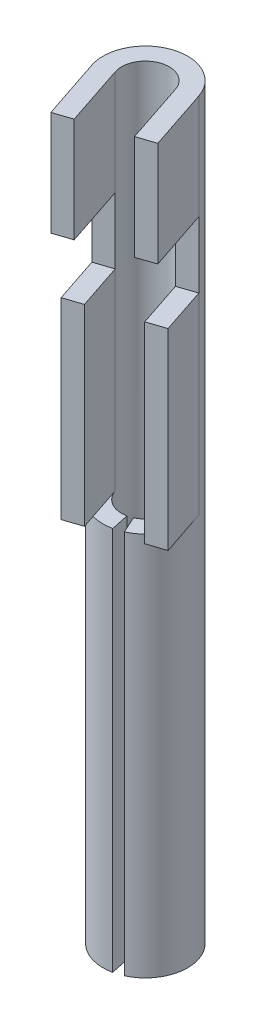
ISO-10303-21;
HEADER;
FILE_DESCRIPTION(('STEP AP214'),'2;1');
FILE_NAME('part.step','',(''),(''),'','','');
FILE_SCHEMA(('AUTOMOTIVE_DESIGN { 1 0 10303 214 1 1 1 1 }'));
ENDSEC;
DATA;
#1=APPLICATION_CONTEXT('core data for automotive mechanical design processes');
#2=APPLICATION_PROTOCOL_DEFINITION('international standard','automotive_design',2000,#1);
#3=PRODUCT_CONTEXT('',#1,'mechanical');
#4=PRODUCT('Part','Part','',(#3));
#5=PRODUCT_RELATED_PRODUCT_CATEGORY('part','',(#4));
#6=PRODUCT_DEFINITION_FORMATION('','',#4);
#7=PRODUCT_DEFINITION_CONTEXT('part definition',#1,'design');
#8=PRODUCT_DEFINITION('design','',#6,#7);
#9=PRODUCT_DEFINITION_SHAPE('','',#8);
#10=(LENGTH_UNIT() NAMED_UNIT(*) SI_UNIT(.MILLI.,.METRE.));
#11=(NAMED_UNIT(*) PLANE_ANGLE_UNIT() SI_UNIT($,.RADIAN.));
#12=(NAMED_UNIT(*) SI_UNIT($,.STERADIAN.) SOLID_ANGLE_UNIT());
#13=UNCERTAINTY_MEASURE_WITH_UNIT(LENGTH_MEASURE(1.E-05),#10,'distance_accuracy_value','');
#14=(GEOMETRIC_REPRESENTATION_CONTEXT(3) GLOBAL_UNCERTAINTY_ASSIGNED_CONTEXT((#13)) GLOBAL_UNIT_ASSIGNED_CONTEXT((#10,
#11,#12)) REPRESENTATION_CONTEXT('',''));
#15=CARTESIAN_POINT('',(0.,0.,0.));
#16=DIRECTION('',(0.,0.,1.));
#17=DIRECTION('',(1.,0.,0.));
#18=AXIS2_PLACEMENT_3D('',#15,#16,#17);
#19=CARTESIAN_POINT('',(0.,9.525,0.));
#20=DIRECTION('',(0.,-1.,0.));
#21=DIRECTION('',(0.,0.,-1.));
#22=AXIS2_PLACEMENT_3D('',#19,#20,#21);
#23=PLANE('',#22);
#24=DIRECTION('',(0.315988717367818,0.,0.948762947472255));
#25=VECTOR('',#24,1.);
#26=CARTESIAN_POINT('',(0.66271091880937,9.525,-0.22071811908142));
#27=LINE('',#26,#25);
#28=CARTESIAN_POINT('',(0.66271091880937,9.525,-0.22071811908142));
#29=VERTEX_POINT('',#28);
#30=CARTESIAN_POINT('',(0.916497603118433,9.525,0.54128188091862));
#31=VERTEX_POINT('',#30);
#32=EDGE_CURVE('E277',#29,#31,#27,.T.);
#33=ORIENTED_EDGE('',*,*,#32,.F.);
#34=DIRECTION('',(-0.948762947472255,0.,0.315988717367819));
#35=VECTOR('',#34,1.);
#36=CARTESIAN_POINT('',(0.66271091880937,9.525,-0.22071811908142));
#37=LINE('',#36,#35);
#38=CARTESIAN_POINT('',(0.373527972419827,9.525,-0.124404758027663));
#39=VERTEX_POINT('',#38);
#40=EDGE_CURVE('E255',#29,#39,#37,.T.);
#41=ORIENTED_EDGE('',*,*,#40,.T.);
#42=DIRECTION('',(0.315988717367818,0.,0.948762947472255));
#43=VECTOR('',#42,1.);
#44=CARTESIAN_POINT('',(0.373527972419827,9.525,-0.124404758027663));
#45=LINE('',#44,#43);
#46=CARTESIAN_POINT('',(0.62731465672889,9.525,0.637595241972266));
#47=VERTEX_POINT('',#46);
#48=EDGE_CURVE('E271',#39,#47,#45,.T.);
#49=ORIENTED_EDGE('',*,*,#48,.T.);
#50=DIRECTION('',(-0.948762947472255,0.,0.315988717367818));
#51=VECTOR('',#50,1.);
#52=CARTESIAN_POINT('',(0.916497603118433,9.525,0.54128188091862));
#53=LINE('',#52,#51);
#54=EDGE_CURVE('E273',#31,#47,#53,.T.);
#55=ORIENTED_EDGE('',*,*,#54,.F.);
#56=EDGE_LOOP('',(#33,#41,#49,#55));
#57=FACE_BOUND('',#56,.T.);
#58=ADVANCED_FACE('F36',(#57),#23,.F.);
#59=CARTESIAN_POINT('',(0.,6.35,0.));
#60=DIRECTION('',(0.,1.,0.));
#61=DIRECTION('',(0.,0.,1.));
#62=AXIS2_PLACEMENT_3D('',#59,#60,#61);
#63=PLANE('',#62);
#64=DIRECTION('',(0.315988717367818,0.,0.948762947472255));
#65=VECTOR('',#64,1.);
#66=CARTESIAN_POINT('',(0.373527972419827,6.35,-0.124404758027663));
#67=LINE('',#66,#65);
#68=CARTESIAN_POINT('',(0.373527972419827,6.35,-0.124404758027663));
#69=VERTEX_POINT('',#68);
#70=CARTESIAN_POINT('',(0.555846222386493,6.35,0.423009724543899));
#71=VERTEX_POINT('',#70);
#72=EDGE_CURVE('E53',#69,#71,#67,.T.);
#73=ORIENTED_EDGE('',*,*,#72,.F.);
#74=CARTESIAN_POINT('',(0.,6.35,0.));
#75=DIRECTION('',(0.,1.,0.));
#76=DIRECTION('',(1.,0.,0.));
#77=AXIS2_PLACEMENT_3D('',#74,#75,#76);
#78=CIRCLE('',#77,0.3937);
#79=CARTESIAN_POINT('',(0.162640998756903,6.35,0.358535347662392));
#80=VERTEX_POINT('',#79);
#81=EDGE_CURVE('E403',#80,#69,#78,.T.);
#82=ORIENTED_EDGE('',*,*,#81,.F.);
#83=DIRECTION('',(-0.413108963060462,0.,-0.910681604425559));
#84=VECTOR('',#83,1.);
#85=CARTESIAN_POINT('',(0.288556610697732,6.35,0.636111100691283));
#86=LINE('',#85,#84);
#87=CARTESIAN_POINT('',(0.288556610697732,6.35,0.636111100691283));
#88=VERTEX_POINT('',#87);
#89=EDGE_CURVE('E389',#88,#80,#86,.T.);
#90=ORIENTED_EDGE('',*,*,#89,.F.);
#91=CARTESIAN_POINT('',(0.,6.35,0.));
#92=DIRECTION('',(0.,1.,0.));
#93=DIRECTION('',(0.,0.,1.));
#94=AXIS2_PLACEMENT_3D('',#91,#92,#93);
#95=CIRCLE('',#94,0.6985);
#96=EDGE_CURVE('E353',#88,#71,#95,.T.);
#97=ORIENTED_EDGE('',*,*,#96,.T.);
#98=EDGE_LOOP('',(#73,#82,#90,#97));
#99=FACE_BOUND('',#98,.T.);
#100=ADVANCED_FACE('F412',(#99),#63,.T.);
#101=CARTESIAN_POINT('',(0.,6.35,0.));
#102=DIRECTION('',(0.,-1.,0.));
#103=DIRECTION('',(0.,0.,-1.));
#104=AXIS2_PLACEMENT_3D('',#101,#102,#103);
#105=CYLINDRICAL_SURFACE('',#104,0.6985);
#106=CARTESIAN_POINT('',(0.,0.,0.));
#107=DIRECTION('',(0.,1.,0.));
#108=DIRECTION('',(0.,0.,1.));
#109=AXIS2_PLACEMENT_3D('',#106,#107,#108);
#110=CIRCLE('',#109,0.6985);
#111=CARTESIAN_POINT('',(0.288556610697732,0.,0.636111100691283));
#112=VERTEX_POINT('',#111);
#113=CARTESIAN_POINT('',(0.144278305348866,0.,0.683436917795377));
#114=VERTEX_POINT('',#113);
#115=EDGE_CURVE('E345',#112,#114,#110,.T.);
#116=ORIENTED_EDGE('',*,*,#115,.T.);
#117=DIRECTION('',(0.,-1.,0.));
#118=VECTOR('',#117,1.);
#119=CARTESIAN_POINT('',(0.144278305348866,6.35,0.683436917795377));
#120=LINE('',#119,#118);
#121=CARTESIAN_POINT('',(0.144278305348866,6.35,0.683436917795377));
#122=VERTEX_POINT('',#121);
#123=EDGE_CURVE('E45',#122,#114,#120,.T.);
#124=ORIENTED_EDGE('',*,*,#123,.F.);
#125=CARTESIAN_POINT('',(-0.191209722453162,6.35,0.671819240599225));
#126=VERTEX_POINT('',#125);
#127=EDGE_CURVE('E362',#126,#122,#95,.T.);
#128=ORIENTED_EDGE('',*,*,#127,.F.);
#129=CARTESIAN_POINT('',(-0.66271091880937,6.35,0.22071811908142));
#130=VERTEX_POINT('',#129);
#131=EDGE_CURVE('E367',#130,#126,#95,.T.);
#132=ORIENTED_EDGE('',*,*,#131,.F.);
#133=DIRECTION('',(0.,-1.,0.));
#134=VECTOR('',#133,1.);
#135=CARTESIAN_POINT('',(-0.66271091880937,9.525,0.22071811908142));
#136=LINE('',#135,#134);
#137=CARTESIAN_POINT('',(-0.66271091880937,9.525,0.22071811908142));
#138=VERTEX_POINT('',#137);
#139=EDGE_CURVE('E315',#138,#130,#136,.T.);
#140=ORIENTED_EDGE('',*,*,#139,.F.);
#141=DIRECTION('',(0.,-1.,0.));
#142=VECTOR('',#141,1.);
#143=CARTESIAN_POINT('',(-0.66271091880937,10.6172,0.22071811908142));
#144=LINE('',#143,#142);
#145=CARTESIAN_POINT('',(-0.66271091880937,10.6172,0.22071811908142));
#146=VERTEX_POINT('',#145);
#147=EDGE_CURVE('E268',#146,#138,#144,.T.);
#148=ORIENTED_EDGE('',*,*,#147,.F.);
#149=DIRECTION('',(0.,-1.,0.));
#150=VECTOR('',#149,1.);
#151=CARTESIAN_POINT('',(-0.66271091880937,12.3444,0.22071811908142));
#152=LINE('',#151,#150);
#153=CARTESIAN_POINT('',(-0.66271091880937,12.3444,0.22071811908142));
#154=VERTEX_POINT('',#153);
#155=EDGE_CURVE('E245',#154,#146,#152,.T.);
#156=ORIENTED_EDGE('',*,*,#155,.F.);
#157=CARTESIAN_POINT('',(0.,12.3444,0.));
#158=DIRECTION('',(0.,-1.,0.));
#159=DIRECTION('',(0.,0.,1.));
#160=AXIS2_PLACEMENT_3D('',#157,#158,#159);
#161=CIRCLE('',#160,0.6985);
#162=CARTESIAN_POINT('',(0.66271091880937,12.3444,-0.22071811908142));
#163=VERTEX_POINT('',#162);
#164=EDGE_CURVE('E208',#154,#163,#161,.T.);
#165=ORIENTED_EDGE('',*,*,#164,.T.);
#166=DIRECTION('',(0.,-1.,0.));
#167=VECTOR('',#166,1.);
#168=CARTESIAN_POINT('',(0.66271091880937,12.3444,-0.22071811908142));
#169=LINE('',#168,#167);
#170=CARTESIAN_POINT('',(0.66271091880937,10.6172,-0.22071811908142));
#171=VERTEX_POINT('',#170);
#172=EDGE_CURVE('E247',#163,#171,#169,.T.);
#173=ORIENTED_EDGE('',*,*,#172,.T.);
#174=DIRECTION('',(0.,-1.,0.));
#175=VECTOR('',#174,1.);
#176=CARTESIAN_POINT('',(0.66271091880937,10.6172,-0.22071811908142));
#177=LINE('',#176,#175);
#178=EDGE_CURVE('E258',#171,#29,#177,.T.);
#179=ORIENTED_EDGE('',*,*,#178,.T.);
#180=DIRECTION('',(0.,-1.,0.));
#181=VECTOR('',#180,1.);
#182=CARTESIAN_POINT('',(0.66271091880937,9.525,-0.22071811908142));
#183=LINE('',#182,#181);
#184=CARTESIAN_POINT('',(0.66271091880937,6.35,-0.22071811908142));
#185=VERTEX_POINT('',#184);
#186=EDGE_CURVE('E318',#29,#185,#183,.T.);
#187=ORIENTED_EDGE('',*,*,#186,.T.);
#188=EDGE_CURVE('E357',#71,#185,#95,.T.);
#189=ORIENTED_EDGE('',*,*,#188,.F.);
#190=ORIENTED_EDGE('',*,*,#96,.F.);
#191=DIRECTION('',(0.,-1.,0.));
#192=VECTOR('',#191,1.);
#193=CARTESIAN_POINT('',(0.288556610697732,6.35,0.636111100691283));
#194=LINE('',#193,#192);
#195=EDGE_CURVE('E386',#88,#112,#194,.T.);
#196=ORIENTED_EDGE('',*,*,#195,.T.);
#197=EDGE_LOOP('',(#116,#124,#128,#132,#140,#148,#156,#165,#173,#179,#187,#189,#190,#196));
#198=FACE_BOUND('',#197,.T.);
#199=ADVANCED_FACE('F38',(#198),#105,.T.);
#200=CARTESIAN_POINT('',(0.081320499378452,6.35,0.385209899121053));
#201=DIRECTION('',(0.978435100637634,0.,-0.206554481530231));
#202=DIRECTION('',(-0.206554481530231,0.,-0.978435100637634));
#203=AXIS2_PLACEMENT_3D('',#200,#201,#202);
#204=PLANE('',#203);
#205=DIRECTION('',(0.206554481530231,0.,0.978435100637634));
#206=VECTOR('',#205,1.);
#207=CARTESIAN_POINT('',(0.081320499378452,0.,0.385209899121053));
#208=LINE('',#207,#206);
#209=CARTESIAN_POINT('',(0.081320499378452,0.,0.385209899121053));
#210=VERTEX_POINT('',#209);
#211=EDGE_CURVE('E348',#210,#114,#208,.T.);
#212=ORIENTED_EDGE('',*,*,#211,.F.);
#213=DIRECTION('',(0.,-1.,0.));
#214=VECTOR('',#213,1.);
#215=CARTESIAN_POINT('',(0.081320499378452,6.35,0.385209899121053));
#216=LINE('',#215,#214);
#217=CARTESIAN_POINT('',(0.081320499378452,6.35,0.385209899121053));
#218=VERTEX_POINT('',#217);
#219=EDGE_CURVE('E390',#218,#210,#216,.T.);
#220=ORIENTED_EDGE('',*,*,#219,.F.);
#221=DIRECTION('',(0.206554481530231,0.,0.978435100637634));
#222=VECTOR('',#221,1.);
#223=CARTESIAN_POINT('',(0.081320499378452,6.35,0.385209899121053));
#224=LINE('',#223,#222);
#225=EDGE_CURVE('E356',#218,#122,#224,.T.);
#226=ORIENTED_EDGE('',*,*,#225,.T.);
#227=ORIENTED_EDGE('',*,*,#123,.T.);
#228=EDGE_LOOP('',(#212,#220,#226,#227));
#229=FACE_BOUND('',#228,.T.);
#230=ADVANCED_FACE('F396',(#229),#204,.T.);
#231=CARTESIAN_POINT('',(0.,6.35,0.));
#232=DIRECTION('',(0.,-1.,0.));
#233=DIRECTION('',(0.,0.,-1.));
#234=AXIS2_PLACEMENT_3D('',#231,#232,#233);
#235=CYLINDRICAL_SURFACE('',#234,0.3937);
#236=CARTESIAN_POINT('',(0.,0.,0.));
#237=DIRECTION('',(0.,1.,0.));
#238=DIRECTION('',(1.,0.,0.));
#239=AXIS2_PLACEMENT_3D('',#236,#237,#238);
#240=CIRCLE('',#239,0.3937);
#241=CARTESIAN_POINT('',(0.162640998756903,0.,0.358535347662392));
#242=VERTEX_POINT('',#241);
#243=EDGE_CURVE('E377',#242,#210,#240,.T.);
#244=ORIENTED_EDGE('',*,*,#243,.F.);
#245=DIRECTION('',(0.,-1.,0.));
#246=VECTOR('',#245,1.);
#247=CARTESIAN_POINT('',(0.162640998756903,6.35,0.358535347662392));
#248=LINE('',#247,#246);
#249=EDGE_CURVE('E388',#80,#242,#248,.T.);
#250=ORIENTED_EDGE('',*,*,#249,.F.);
#251=ORIENTED_EDGE('',*,*,#81,.T.);
#252=DIRECTION('',(0.,-1.,0.));
#253=VECTOR('',#252,1.);
#254=CARTESIAN_POINT('',(0.373527972419827,9.525,-0.124404758027663));
#255=LINE('',#254,#253);
#256=EDGE_CURVE('E289',#39,#69,#255,.T.);
#257=ORIENTED_EDGE('',*,*,#256,.F.);
#258=DIRECTION('',(0.,-1.,0.));
#259=VECTOR('',#258,1.);
#260=CARTESIAN_POINT('',(0.373527972419827,10.6172,-0.124404758027663));
#261=LINE('',#260,#259);
#262=CARTESIAN_POINT('',(0.373527972419827,10.6172,-0.124404758027663));
#263=VERTEX_POINT('',#262);
#264=EDGE_CURVE('E264',#263,#39,#261,.T.);
#265=ORIENTED_EDGE('',*,*,#264,.F.);
#266=DIRECTION('',(0.,-1.,0.));
#267=VECTOR('',#266,1.);
#268=CARTESIAN_POINT('',(0.373527972419827,12.3444,-0.124404758027663));
#269=LINE('',#268,#267);
#270=CARTESIAN_POINT('',(0.373527972419827,12.3444,-0.124404758027663));
#271=VERTEX_POINT('',#270);
#272=EDGE_CURVE('E222',#271,#263,#269,.T.);
#273=ORIENTED_EDGE('',*,*,#272,.F.);
#274=CARTESIAN_POINT('',(0.,12.3444,0.));
#275=DIRECTION('',(0.,1.,0.));
#276=DIRECTION('',(1.,0.,0.));
#277=AXIS2_PLACEMENT_3D('',#274,#275,#276);
#278=CIRCLE('',#277,0.3937);
#279=CARTESIAN_POINT('',(-0.373527972419827,12.3444,0.124404758027663));
#280=VERTEX_POINT('',#279);
#281=EDGE_CURVE('E189',#280,#271,#278,.F.);
#282=ORIENTED_EDGE('',*,*,#281,.F.);
#283=DIRECTION('',(0.,-1.,0.));
#284=VECTOR('',#283,1.);
#285=CARTESIAN_POINT('',(-0.373527972419827,12.3444,0.124404758027663));
#286=LINE('',#285,#284);
#287=CARTESIAN_POINT('',(-0.373527972419827,10.6172,0.124404758027663));
#288=VERTEX_POINT('',#287);
#289=EDGE_CURVE('E238',#280,#288,#286,.T.);
#290=ORIENTED_EDGE('',*,*,#289,.T.);
#291=DIRECTION('',(0.,-1.,0.));
#292=VECTOR('',#291,1.);
#293=CARTESIAN_POINT('',(-0.373527972419827,10.6172,0.124404758027663));
#294=LINE('',#293,#292);
#295=CARTESIAN_POINT('',(-0.373527972419827,9.525,0.124404758027663));
#296=VERTEX_POINT('',#295);
#297=EDGE_CURVE('E266',#288,#296,#294,.T.);
#298=ORIENTED_EDGE('',*,*,#297,.T.);
#299=DIRECTION('',(0.,-1.,0.));
#300=VECTOR('',#299,1.);
#301=CARTESIAN_POINT('',(-0.373527972419827,9.525,0.124404758027663));
#302=LINE('',#301,#300);
#303=CARTESIAN_POINT('',(-0.373527972419827,6.35,0.124404758027663));
#304=VERTEX_POINT('',#303);
#305=EDGE_CURVE('E299',#296,#304,#302,.T.);
#306=ORIENTED_EDGE('',*,*,#305,.T.);
#307=EDGE_CURVE('E406',#304,#218,#78,.T.);
#308=ORIENTED_EDGE('',*,*,#307,.T.);
#309=ORIENTED_EDGE('',*,*,#219,.T.);
#310=EDGE_LOOP('',(#244,#250,#251,#257,#265,#273,#282,#290,#298,#306,#308,#309));
#311=FACE_BOUND('',#310,.T.);
#312=ADVANCED_FACE('F407',(#311),#235,.F.);
#313=CARTESIAN_POINT('',(0.288556610697732,6.35,0.636111100691283));
#314=DIRECTION('',(-0.910681604425559,0.,0.413108963060462));
#315=DIRECTION('',(0.413108963060462,0.,0.910681604425559));
#316=AXIS2_PLACEMENT_3D('',#313,#314,#315);
#317=PLANE('',#316);
#318=DIRECTION('',(-0.413108963060462,0.,-0.910681604425559));
#319=VECTOR('',#318,1.);
#320=CARTESIAN_POINT('',(0.288556610697732,0.,0.636111100691283));
#321=LINE('',#320,#319);
#322=EDGE_CURVE('E373',#112,#242,#321,.T.);
#323=ORIENTED_EDGE('',*,*,#322,.F.);
#324=ORIENTED_EDGE('',*,*,#195,.F.);
#325=ORIENTED_EDGE('',*,*,#89,.T.);
#326=ORIENTED_EDGE('',*,*,#249,.T.);
#327=EDGE_LOOP('',(#323,#324,#325,#326));
#328=FACE_BOUND('',#327,.T.);
#329=ADVANCED_FACE('F410',(#328),#317,.T.);
#330=DIRECTION('',(-0.31598871736782,0.,-0.948762947472255));
#331=VECTOR('',#330,1.);
#332=CARTESIAN_POINT('',(-0.373527972419826,6.35,0.124404758027663));
#333=LINE('',#332,#331);
#334=EDGE_CURVE('E11',#126,#304,#333,.T.);
#335=ORIENTED_EDGE('',*,*,#334,.F.);
#336=ORIENTED_EDGE('',*,*,#127,.T.);
#337=ORIENTED_EDGE('',*,*,#225,.F.);
#338=ORIENTED_EDGE('',*,*,#307,.F.);
#339=EDGE_LOOP('',(#335,#336,#337,#338));
#340=FACE_BOUND('',#339,.T.);
#341=ADVANCED_FACE('F408',(#340),#63,.T.);
#342=CARTESIAN_POINT('',(0.,0.,0.));
#343=DIRECTION('',(0.,1.,0.));
#344=DIRECTION('',(0.,0.,1.));
#345=AXIS2_PLACEMENT_3D('',#342,#343,#344);
#346=PLANE('',#345);
#347=ORIENTED_EDGE('',*,*,#115,.F.);
#348=ORIENTED_EDGE('',*,*,#322,.T.);
#349=ORIENTED_EDGE('',*,*,#243,.T.);
#350=ORIENTED_EDGE('',*,*,#211,.T.);
#351=EDGE_LOOP('',(#347,#348,#349,#350));
#352=FACE_BOUND('',#351,.T.);
#353=ADVANCED_FACE('F400',(#352),#346,.F.);
#354=CARTESIAN_POINT('',(0.,6.35,0.));
#355=DIRECTION('',(0.,-1.,0.));
#356=DIRECTION('',(0.,0.,-1.));
#357=AXIS2_PLACEMENT_3D('',#354,#355,#356);
#358=PLANE('',#357);
#359=CARTESIAN_POINT('',(0.62731465672889,6.35,0.637595241972266));
#360=VERTEX_POINT('',#359);
#361=EDGE_CURVE('E270',#71,#360,#67,.T.);
#362=ORIENTED_EDGE('',*,*,#361,.F.);
#363=ORIENTED_EDGE('',*,*,#188,.T.);
#364=DIRECTION('',(0.315988717367818,0.,0.948762947472255));
#365=VECTOR('',#364,1.);
#366=CARTESIAN_POINT('',(0.66271091880937,6.35,-0.22071811908142));
#367=LINE('',#366,#365);
#368=CARTESIAN_POINT('',(0.916497603118433,6.35,0.54128188091862));
#369=VERTEX_POINT('',#368);
#370=EDGE_CURVE('E325',#185,#369,#367,.T.);
#371=ORIENTED_EDGE('',*,*,#370,.T.);
#372=DIRECTION('',(-0.948762947472255,0.,0.315988717367818));
#373=VECTOR('',#372,1.);
#374=CARTESIAN_POINT('',(0.916497603118433,6.35,0.54128188091862));
#375=LINE('',#374,#373);
#376=EDGE_CURVE('E292',#369,#360,#375,.T.);
#377=ORIENTED_EDGE('',*,*,#376,.T.);
#378=EDGE_LOOP('',(#362,#363,#371,#377));
#379=FACE_BOUND('',#378,.T.);
#380=ADVANCED_FACE('F338',(#379),#358,.T.);
#381=CARTESIAN_POINT('',(0.373527972419827,9.525,-0.124404758027663));
#382=DIRECTION('',(0.948762947472255,0.,-0.315988717367818));
#383=DIRECTION('',(-0.315988717367818,0.,-0.948762947472255));
#384=AXIS2_PLACEMENT_3D('',#381,#382,#383);
#385=PLANE('',#384);
#386=ORIENTED_EDGE('',*,*,#72,.T.);
#387=ORIENTED_EDGE('',*,*,#361,.T.);
#388=DIRECTION('',(0.,-1.,0.));
#389=VECTOR('',#388,1.);
#390=CARTESIAN_POINT('',(0.62731465672889,9.525,0.637595241972266));
#391=LINE('',#390,#389);
#392=EDGE_CURVE('E344',#47,#360,#391,.T.);
#393=ORIENTED_EDGE('',*,*,#392,.F.);
#394=ORIENTED_EDGE('',*,*,#48,.F.);
#395=ORIENTED_EDGE('',*,*,#256,.T.);
#396=EDGE_LOOP('',(#386,#387,#393,#394,#395));
#397=FACE_BOUND('',#396,.T.);
#398=ADVANCED_FACE('F641',(#397),#385,.F.);
#399=CARTESIAN_POINT('',(0.916497603118433,9.525,0.54128188091862));
#400=DIRECTION('',(0.315988717367818,0.,0.948762947472255));
#401=DIRECTION('',(0.948762947472255,0.,-0.315988717367818));
#402=AXIS2_PLACEMENT_3D('',#399,#400,#401);
#403=PLANE('',#402);
#404=ORIENTED_EDGE('',*,*,#376,.F.);
#405=DIRECTION('',(0.,-1.,0.));
#406=VECTOR('',#405,1.);
#407=CARTESIAN_POINT('',(0.916497603118433,9.525,0.54128188091862));
#408=LINE('',#407,#406);
#409=EDGE_CURVE('E330',#31,#369,#408,.T.);
#410=ORIENTED_EDGE('',*,*,#409,.F.);
#411=ORIENTED_EDGE('',*,*,#54,.T.);
#412=ORIENTED_EDGE('',*,*,#392,.T.);
#413=EDGE_LOOP('',(#404,#410,#411,#412));
#414=FACE_BOUND('',#413,.T.);
#415=ADVANCED_FACE('F341',(#414),#403,.T.);
#416=CARTESIAN_POINT('',(0.66271091880937,9.525,-0.22071811908142));
#417=DIRECTION('',(0.948762947472255,0.,-0.315988717367818));
#418=DIRECTION('',(-0.315988717367818,0.,-0.948762947472255));
#419=AXIS2_PLACEMENT_3D('',#416,#417,#418);
#420=PLANE('',#419);
#421=ORIENTED_EDGE('',*,*,#370,.F.);
#422=ORIENTED_EDGE('',*,*,#186,.F.);
#423=ORIENTED_EDGE('',*,*,#32,.T.);
#424=ORIENTED_EDGE('',*,*,#409,.T.);
#425=EDGE_LOOP('',(#421,#422,#423,#424));
#426=FACE_BOUND('',#425,.T.);
#427=ADVANCED_FACE('F656',(#426),#420,.T.);
#428=CARTESIAN_POINT('',(-0.66271091880937,9.525,0.22071811908142));
#429=DIRECTION('',(-0.948762947472255,0.,0.31598871736782));
#430=DIRECTION('',(0.31598871736782,0.,0.948762947472255));
#431=AXIS2_PLACEMENT_3D('',#428,#429,#430);
#432=PLANE('',#431);
#433=DIRECTION('',(-0.31598871736782,0.,-0.948762947472255));
#434=VECTOR('',#433,1.);
#435=CARTESIAN_POINT('',(-0.66271091880937,6.35,0.22071811908142));
#436=LINE('',#435,#434);
#437=CARTESIAN_POINT('',(-0.408924234500305,6.35,0.98271811908146));
#438=VERTEX_POINT('',#437);
#439=EDGE_CURVE('E321',#438,#130,#436,.T.);
#440=ORIENTED_EDGE('',*,*,#439,.F.);
#441=DIRECTION('',(0.,-1.,0.));
#442=VECTOR('',#441,1.);
#443=CARTESIAN_POINT('',(-0.408924234500305,9.525,0.98271811908146));
#444=LINE('',#443,#442);
#445=CARTESIAN_POINT('',(-0.408924234500305,9.525,0.98271811908146));
#446=VERTEX_POINT('',#445);
#447=EDGE_CURVE('E308',#446,#438,#444,.T.);
#448=ORIENTED_EDGE('',*,*,#447,.F.);
#449=DIRECTION('',(-0.31598871736782,0.,-0.948762947472255));
#450=VECTOR('',#449,1.);
#451=CARTESIAN_POINT('',(-0.66271091880937,9.525,0.22071811908142));
#452=LINE('',#451,#450);
#453=EDGE_CURVE('E280',#446,#138,#452,.T.);
#454=ORIENTED_EDGE('',*,*,#453,.T.);
#455=ORIENTED_EDGE('',*,*,#139,.T.);
#456=EDGE_LOOP('',(#440,#448,#454,#455));
#457=FACE_BOUND('',#456,.T.);
#458=ADVANCED_FACE('F454',(#457),#432,.T.);
#459=CARTESIAN_POINT('',(-0.119741288110763,9.525,0.886404758027703));
#460=DIRECTION('',(0.31598871736782,0.,0.948762947472255));
#461=DIRECTION('',(0.948762947472255,0.,-0.31598871736782));
#462=AXIS2_PLACEMENT_3D('',#459,#460,#461);
#463=PLANE('',#462);
#464=DIRECTION('',(-0.948762947472255,0.,0.31598871736782));
#465=VECTOR('',#464,1.);
#466=CARTESIAN_POINT('',(-0.119741288110763,6.35,0.886404758027703));
#467=LINE('',#466,#465);
#468=CARTESIAN_POINT('',(-0.119741288110763,6.35,0.886404758027703));
#469=VERTEX_POINT('',#468);
#470=EDGE_CURVE('E324',#469,#438,#467,.T.);
#471=ORIENTED_EDGE('',*,*,#470,.F.);
#472=DIRECTION('',(0.,-1.,0.));
#473=VECTOR('',#472,1.);
#474=CARTESIAN_POINT('',(-0.119741288110763,9.525,0.886404758027703));
#475=LINE('',#474,#473);
#476=CARTESIAN_POINT('',(-0.119741288110763,9.525,0.886404758027703));
#477=VERTEX_POINT('',#476);
#478=EDGE_CURVE('E304',#477,#469,#475,.T.);
#479=ORIENTED_EDGE('',*,*,#478,.F.);
#480=DIRECTION('',(-0.948762947472255,0.,0.31598871736782));
#481=VECTOR('',#480,1.);
#482=CARTESIAN_POINT('',(-0.119741288110763,9.525,0.886404758027703));
#483=LINE('',#482,#481);
#484=EDGE_CURVE('E283',#477,#446,#483,.T.);
#485=ORIENTED_EDGE('',*,*,#484,.T.);
#486=ORIENTED_EDGE('',*,*,#447,.T.);
#487=EDGE_LOOP('',(#471,#479,#485,#486));
#488=FACE_BOUND('',#487,.T.);
#489=ADVANCED_FACE('F440',(#488),#463,.T.);
#490=CARTESIAN_POINT('',(-0.373527972419826,9.525,0.124404758027663));
#491=DIRECTION('',(-0.948762947472255,0.,0.31598871736782));
#492=DIRECTION('',(0.31598871736782,0.,0.948762947472255));
#493=AXIS2_PLACEMENT_3D('',#490,#491,#492);
#494=PLANE('',#493);
#495=EDGE_CURVE('E274',#469,#126,#333,.T.);
#496=ORIENTED_EDGE('',*,*,#495,.T.);
#497=ORIENTED_EDGE('',*,*,#334,.T.);
#498=ORIENTED_EDGE('',*,*,#305,.F.);
#499=DIRECTION('',(-0.31598871736782,0.,-0.948762947472255));
#500=VECTOR('',#499,1.);
#501=CARTESIAN_POINT('',(-0.373527972419826,9.525,0.124404758027663));
#502=LINE('',#501,#500);
#503=EDGE_CURVE('E286',#477,#296,#502,.T.);
#504=ORIENTED_EDGE('',*,*,#503,.F.);
#505=ORIENTED_EDGE('',*,*,#478,.T.);
#506=EDGE_LOOP('',(#496,#497,#498,#504,#505));
#507=FACE_BOUND('',#506,.T.);
#508=ADVANCED_FACE('F433',(#507),#494,.F.);
#509=ORIENTED_EDGE('',*,*,#503,.T.);
#510=DIRECTION('',(-0.948762947472255,0.,0.31598871736782));
#511=VECTOR('',#510,1.);
#512=CARTESIAN_POINT('',(-0.373527972419827,9.525,0.124404758027663));
#513=LINE('',#512,#511);
#514=EDGE_CURVE('E202',#296,#138,#513,.T.);
#515=ORIENTED_EDGE('',*,*,#514,.T.);
#516=ORIENTED_EDGE('',*,*,#453,.F.);
#517=ORIENTED_EDGE('',*,*,#484,.F.);
#518=EDGE_LOOP('',(#509,#515,#516,#517));
#519=FACE_BOUND('',#518,.T.);
#520=ADVANCED_FACE('F425',(#519),#23,.F.);
#521=ORIENTED_EDGE('',*,*,#439,.T.);
#522=ORIENTED_EDGE('',*,*,#131,.T.);
#523=ORIENTED_EDGE('',*,*,#495,.F.);
#524=ORIENTED_EDGE('',*,*,#470,.T.);
#525=EDGE_LOOP('',(#521,#522,#523,#524));
#526=FACE_BOUND('',#525,.T.);
#527=ADVANCED_FACE('F432',(#526),#358,.T.);
#528=CARTESIAN_POINT('',(-0.373527972419827,10.6172,0.124404758027663));
#529=DIRECTION('',(0.31598871736782,0.,0.948762947472255));
#530=DIRECTION('',(0.948762947472255,0.,-0.31598871736782));
#531=AXIS2_PLACEMENT_3D('',#528,#529,#530);
#532=PLANE('',#531);
#533=ORIENTED_EDGE('',*,*,#514,.F.);
#534=ORIENTED_EDGE('',*,*,#297,.F.);
#535=DIRECTION('',(-0.948762947472255,0.,0.31598871736782));
#536=VECTOR('',#535,1.);
#537=CARTESIAN_POINT('',(-0.373527972419827,10.6172,0.124404758027663));
#538=LINE('',#537,#536);
#539=EDGE_CURVE('E251',#288,#146,#538,.T.);
#540=ORIENTED_EDGE('',*,*,#539,.T.);
#541=ORIENTED_EDGE('',*,*,#147,.T.);
#542=EDGE_LOOP('',(#533,#534,#540,#541));
#543=FACE_BOUND('',#542,.T.);
#544=ADVANCED_FACE('F439',(#543),#532,.T.);
#545=CARTESIAN_POINT('',(0.66271091880937,10.6172,-0.22071811908142));
#546=DIRECTION('',(0.315988717367819,0.,0.948762947472255));
#547=DIRECTION('',(0.948762947472255,0.,-0.315988717367819));
#548=AXIS2_PLACEMENT_3D('',#545,#546,#547);
#549=PLANE('',#548);
#550=ORIENTED_EDGE('',*,*,#40,.F.);
#551=ORIENTED_EDGE('',*,*,#178,.F.);
#552=DIRECTION('',(-0.948762947472255,0.,0.315988717367819));
#553=VECTOR('',#552,1.);
#554=CARTESIAN_POINT('',(0.66271091880937,10.6172,-0.22071811908142));
#555=LINE('',#554,#553);
#556=EDGE_CURVE('E254',#171,#263,#555,.T.);
#557=ORIENTED_EDGE('',*,*,#556,.T.);
#558=ORIENTED_EDGE('',*,*,#264,.T.);
#559=EDGE_LOOP('',(#550,#551,#557,#558));
#560=FACE_BOUND('',#559,.T.);
#561=ADVANCED_FACE('F472',(#560),#549,.T.);
#562=CARTESIAN_POINT('',(0.,10.6172,0.));
#563=DIRECTION('',(0.,-1.,0.));
#564=DIRECTION('',(0.,0.,-1.));
#565=AXIS2_PLACEMENT_3D('',#562,#563,#564);
#566=PLANE('',#565);
#567=ORIENTED_EDGE('',*,*,#539,.F.);
#568=DIRECTION('',(-0.31598871736782,0.,-0.948762947472255));
#569=VECTOR('',#568,1.);
#570=CARTESIAN_POINT('',(-0.373527972419827,10.6172,0.124404758027663));
#571=LINE('',#570,#569);
#572=CARTESIAN_POINT('',(-0.0351457266744076,10.6172,1.14040475802768));
#573=VERTEX_POINT('',#572);
#574=EDGE_CURVE('E193',#573,#288,#571,.T.);
#575=ORIENTED_EDGE('',*,*,#574,.F.);
#576=DIRECTION('',(-0.948762947472255,0.,0.315988717367818));
#577=VECTOR('',#576,1.);
#578=CARTESIAN_POINT('',(-0.0351457266744076,10.6172,1.14040475802768));
#579=LINE('',#578,#577);
#580=CARTESIAN_POINT('',(-0.324328673063951,10.6172,1.23671811908144));
#581=VERTEX_POINT('',#580);
#582=EDGE_CURVE('E232',#573,#581,#579,.T.);
#583=ORIENTED_EDGE('',*,*,#582,.T.);
#584=DIRECTION('',(-0.315988717367819,0.,-0.948762947472255));
#585=VECTOR('',#584,1.);
#586=CARTESIAN_POINT('',(-0.66271091880937,10.6172,0.22071811908142));
#587=LINE('',#586,#585);
#588=EDGE_CURVE('E229',#581,#146,#587,.T.);
#589=ORIENTED_EDGE('',*,*,#588,.T.);
#590=EDGE_LOOP('',(#567,#575,#583,#589));
#591=FACE_BOUND('',#590,.T.);
#592=ADVANCED_FACE('F461',(#591),#566,.T.);
#593=ORIENTED_EDGE('',*,*,#556,.F.);
#594=DIRECTION('',(0.31598871736782,0.,0.948762947472255));
#595=VECTOR('',#594,1.);
#596=CARTESIAN_POINT('',(0.66271091880937,10.6172,-0.22071811908142));
#597=LINE('',#596,#595);
#598=CARTESIAN_POINT('',(1.00109316455479,10.6172,0.795281880918597));
#599=VERTEX_POINT('',#598);
#600=EDGE_CURVE('E226',#171,#599,#597,.T.);
#601=ORIENTED_EDGE('',*,*,#600,.T.);
#602=DIRECTION('',(-0.948762947472254,0.,0.315988717367821));
#603=VECTOR('',#602,1.);
#604=CARTESIAN_POINT('',(1.00109316455479,10.6172,0.795281880918597));
#605=LINE('',#604,#603);
#606=CARTESIAN_POINT('',(0.711910218165246,10.6172,0.891595241972243));
#607=VERTEX_POINT('',#606);
#608=EDGE_CURVE('E224',#599,#607,#605,.T.);
#609=ORIENTED_EDGE('',*,*,#608,.T.);
#610=DIRECTION('',(0.31598871736782,0.,0.948762947472255));
#611=VECTOR('',#610,1.);
#612=CARTESIAN_POINT('',(0.373527972419827,10.6172,-0.124404758027663));
#613=LINE('',#612,#611);
#614=EDGE_CURVE('E198',#263,#607,#613,.T.);
#615=ORIENTED_EDGE('',*,*,#614,.F.);
#616=EDGE_LOOP('',(#593,#601,#609,#615));
#617=FACE_BOUND('',#616,.T.);
#618=ADVANCED_FACE('F474',(#617),#566,.T.);
#619=CARTESIAN_POINT('',(0.373527972419827,12.3444,-0.124404758027663));
#620=DIRECTION('',(0.948762947472255,0.,-0.31598871736782));
#621=DIRECTION('',(-0.31598871736782,0.,-0.948762947472255));
#622=AXIS2_PLACEMENT_3D('',#619,#620,#621);
#623=PLANE('',#622);
#624=ORIENTED_EDGE('',*,*,#614,.T.);
#625=DIRECTION('',(0.,-1.,0.));
#626=VECTOR('',#625,1.);
#627=CARTESIAN_POINT('',(0.711910218165246,12.3444,0.891595241972243));
#628=LINE('',#627,#626);
#629=CARTESIAN_POINT('',(0.711910218165246,12.3444,0.891595241972243));
#630=VERTEX_POINT('',#629);
#631=EDGE_CURVE('E196',#630,#607,#628,.T.);
#632=ORIENTED_EDGE('',*,*,#631,.F.);
#633=DIRECTION('',(0.31598871736782,0.,0.948762947472255));
#634=VECTOR('',#633,1.);
#635=CARTESIAN_POINT('',(0.373527972419827,12.3444,-0.124404758027663));
#636=LINE('',#635,#634);
#637=EDGE_CURVE('E181',#271,#630,#636,.T.);
#638=ORIENTED_EDGE('',*,*,#637,.F.);
#639=ORIENTED_EDGE('',*,*,#272,.T.);
#640=EDGE_LOOP('',(#624,#632,#638,#639));
#641=FACE_BOUND('',#640,.T.);
#642=ADVANCED_FACE('F197',(#641),#623,.F.);
#643=CARTESIAN_POINT('',(1.00109316455479,12.3444,0.795281880918597));
#644=DIRECTION('',(0.315988717367821,0.,0.948762947472254));
#645=DIRECTION('',(0.948762947472254,0.,-0.315988717367821));
#646=AXIS2_PLACEMENT_3D('',#643,#644,#645);
#647=PLANE('',#646);
#648=ORIENTED_EDGE('',*,*,#608,.F.);
#649=DIRECTION('',(0.,-1.,0.));
#650=VECTOR('',#649,1.);
#651=CARTESIAN_POINT('',(1.00109316455479,12.3444,0.795281880918597));
#652=LINE('',#651,#650);
#653=CARTESIAN_POINT('',(1.00109316455479,12.3444,0.795281880918597));
#654=VERTEX_POINT('',#653);
#655=EDGE_CURVE('E203',#654,#599,#652,.T.);
#656=ORIENTED_EDGE('',*,*,#655,.F.);
#657=DIRECTION('',(-0.948762947472254,0.,0.315988717367821));
#658=VECTOR('',#657,1.);
#659=CARTESIAN_POINT('',(1.00109316455479,12.3444,0.795281880918597));
#660=LINE('',#659,#658);
#661=EDGE_CURVE('E186',#654,#630,#660,.T.);
#662=ORIENTED_EDGE('',*,*,#661,.T.);
#663=ORIENTED_EDGE('',*,*,#631,.T.);
#664=EDGE_LOOP('',(#648,#656,#662,#663));
#665=FACE_BOUND('',#664,.T.);
#666=ADVANCED_FACE('F205',(#665),#647,.T.);
#667=CARTESIAN_POINT('',(0.66271091880937,12.3444,-0.22071811908142));
#668=DIRECTION('',(0.948762947472255,0.,-0.31598871736782));
#669=DIRECTION('',(-0.31598871736782,0.,-0.948762947472255));
#670=AXIS2_PLACEMENT_3D('',#667,#668,#669);
#671=PLANE('',#670);
#672=ORIENTED_EDGE('',*,*,#600,.F.);
#673=ORIENTED_EDGE('',*,*,#172,.F.);
#674=DIRECTION('',(0.31598871736782,0.,0.948762947472255));
#675=VECTOR('',#674,1.);
#676=CARTESIAN_POINT('',(0.66271091880937,12.3444,-0.22071811908142));
#677=LINE('',#676,#675);
#678=EDGE_CURVE('E206',#163,#654,#677,.T.);
#679=ORIENTED_EDGE('',*,*,#678,.T.);
#680=ORIENTED_EDGE('',*,*,#655,.T.);
#681=EDGE_LOOP('',(#672,#673,#679,#680));
#682=FACE_BOUND('',#681,.T.);
#683=ADVANCED_FACE('F477',(#682),#671,.T.);
#684=CARTESIAN_POINT('',(-0.66271091880937,12.3444,0.22071811908142));
#685=DIRECTION('',(-0.948762947472255,0.,0.31598871736782));
#686=DIRECTION('',(0.31598871736782,0.,0.948762947472255));
#687=AXIS2_PLACEMENT_3D('',#684,#685,#686);
#688=PLANE('',#687);
#689=ORIENTED_EDGE('',*,*,#588,.F.);
#690=DIRECTION('',(0.,-1.,0.));
#691=VECTOR('',#690,1.);
#692=CARTESIAN_POINT('',(-0.324328673063951,12.3444,1.23671811908144));
#693=LINE('',#692,#691);
#694=CARTESIAN_POINT('',(-0.324328673063951,12.3444,1.23671811908144));
#695=VERTEX_POINT('',#694);
#696=EDGE_CURVE('E243',#695,#581,#693,.T.);
#697=ORIENTED_EDGE('',*,*,#696,.F.);
#698=DIRECTION('',(-0.315988717367819,0.,-0.948762947472255));
#699=VECTOR('',#698,1.);
#700=CARTESIAN_POINT('',(-0.66271091880937,12.3444,0.22071811908142));
#701=LINE('',#700,#699);
#702=EDGE_CURVE('E213',#695,#154,#701,.T.);
#703=ORIENTED_EDGE('',*,*,#702,.T.);
#704=ORIENTED_EDGE('',*,*,#155,.T.);
#705=EDGE_LOOP('',(#689,#697,#703,#704));
#706=FACE_BOUND('',#705,.T.);
#707=ADVANCED_FACE('F481',(#706),#688,.T.);
#708=CARTESIAN_POINT('',(-0.0351457266744076,12.3444,1.14040475802768));
#709=DIRECTION('',(0.315988717367818,0.,0.948762947472255));
#710=DIRECTION('',(0.948762947472255,0.,-0.315988717367818));
#711=AXIS2_PLACEMENT_3D('',#708,#709,#710);
#712=PLANE('',#711);
#713=ORIENTED_EDGE('',*,*,#582,.F.);
#714=DIRECTION('',(0.,-1.,0.));
#715=VECTOR('',#714,1.);
#716=CARTESIAN_POINT('',(-0.0351457266744076,12.3444,1.14040475802768));
#717=LINE('',#716,#715);
#718=CARTESIAN_POINT('',(-0.0351457266744076,12.3444,1.14040475802768));
#719=VERTEX_POINT('',#718);
#720=EDGE_CURVE('E241',#719,#573,#717,.T.);
#721=ORIENTED_EDGE('',*,*,#720,.F.);
#722=DIRECTION('',(-0.948762947472255,0.,0.315988717367818));
#723=VECTOR('',#722,1.);
#724=CARTESIAN_POINT('',(-0.0351457266744076,12.3444,1.14040475802768));
#725=LINE('',#724,#723);
#726=EDGE_CURVE('E216',#719,#695,#725,.T.);
#727=ORIENTED_EDGE('',*,*,#726,.T.);
#728=ORIENTED_EDGE('',*,*,#696,.T.);
#729=EDGE_LOOP('',(#713,#721,#727,#728));
#730=FACE_BOUND('',#729,.T.);
#731=ADVANCED_FACE('F483',(#730),#712,.T.);
#732=CARTESIAN_POINT('',(-0.373527972419827,12.3444,0.124404758027663));
#733=DIRECTION('',(-0.948762947472255,0.,0.31598871736782));
#734=DIRECTION('',(0.31598871736782,0.,0.948762947472255));
#735=AXIS2_PLACEMENT_3D('',#732,#733,#734);
#736=PLANE('',#735);
#737=ORIENTED_EDGE('',*,*,#574,.T.);
#738=ORIENTED_EDGE('',*,*,#289,.F.);
#739=DIRECTION('',(-0.31598871736782,0.,-0.948762947472255));
#740=VECTOR('',#739,1.);
#741=CARTESIAN_POINT('',(-0.373527972419827,12.3444,0.124404758027663));
#742=LINE('',#741,#740);
#743=EDGE_CURVE('E219',#719,#280,#742,.T.);
#744=ORIENTED_EDGE('',*,*,#743,.F.);
#745=ORIENTED_EDGE('',*,*,#720,.T.);
#746=EDGE_LOOP('',(#737,#738,#744,#745));
#747=FACE_BOUND('',#746,.T.);
#748=ADVANCED_FACE('F466',(#747),#736,.F.);
#749=CARTESIAN_POINT('',(0.,12.3444,0.));
#750=DIRECTION('',(0.,-1.,0.));
#751=DIRECTION('',(0.,0.,-1.));
#752=AXIS2_PLACEMENT_3D('',#749,#750,#751);
#753=PLANE('',#752);
#754=ORIENTED_EDGE('',*,*,#637,.T.);
#755=ORIENTED_EDGE('',*,*,#661,.F.);
#756=ORIENTED_EDGE('',*,*,#678,.F.);
#757=ORIENTED_EDGE('',*,*,#164,.F.);
#758=ORIENTED_EDGE('',*,*,#702,.F.);
#759=ORIENTED_EDGE('',*,*,#726,.F.);
#760=ORIENTED_EDGE('',*,*,#743,.T.);
#761=ORIENTED_EDGE('',*,*,#281,.T.);
#762=EDGE_LOOP('',(#754,#755,#756,#757,#758,#759,#760,#761));
#763=FACE_BOUND('',#762,.T.);
#764=ADVANCED_FACE('F183',(#763),#753,.F.);
#765=CLOSED_SHELL('',(#58,#100,#199,#230,#312,#329,#341,#353,#380,#398,#415,#427,#458,#489,#508,
#520,#527,#544,#561,#592,#618,#642,#666,#683,#707,#731,#748,#764));
#766=MANIFOLD_SOLID_BREP('B2',#765);
#767=ADVANCED_BREP_SHAPE_REPRESENTATION('',(#18,#766),#14);
#768=SHAPE_DEFINITION_REPRESENTATION(#9,#767);
ENDSEC;
END-ISO-10303-21;
